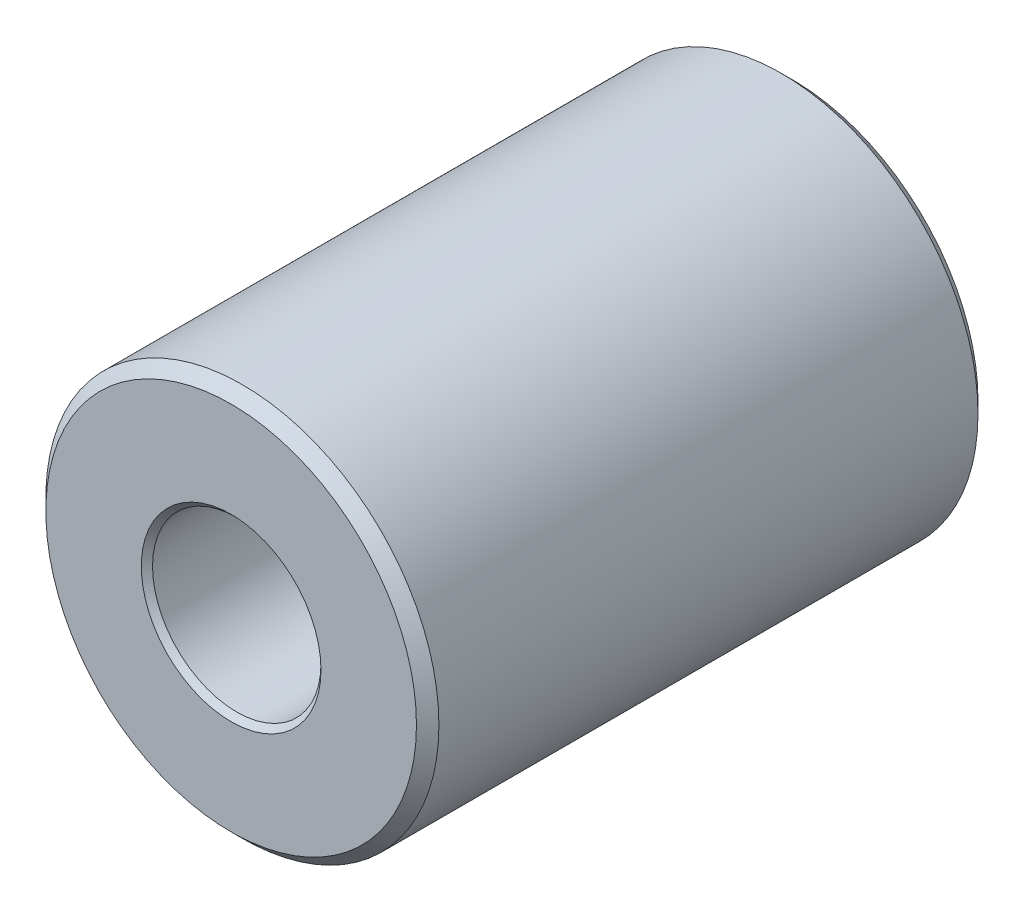
ISO-10303-21;
HEADER;
FILE_DESCRIPTION(('STEP AP214'),'2;1');
FILE_NAME('part.step','',(''),(''),'','','');
FILE_SCHEMA(('AUTOMOTIVE_DESIGN { 1 0 10303 214 1 1 1 1 }'));
ENDSEC;
DATA;
#1=APPLICATION_CONTEXT('core data for automotive mechanical design processes');
#2=APPLICATION_PROTOCOL_DEFINITION('international standard','automotive_design',2000,#1);
#3=PRODUCT_CONTEXT('',#1,'mechanical');
#4=PRODUCT('Part','Part','',(#3));
#5=PRODUCT_RELATED_PRODUCT_CATEGORY('part','',(#4));
#6=PRODUCT_DEFINITION_FORMATION('','',#4);
#7=PRODUCT_DEFINITION_CONTEXT('part definition',#1,'design');
#8=PRODUCT_DEFINITION('design','',#6,#7);
#9=PRODUCT_DEFINITION_SHAPE('','',#8);
#10=(LENGTH_UNIT() NAMED_UNIT(*) SI_UNIT(.MILLI.,.METRE.));
#11=(NAMED_UNIT(*) PLANE_ANGLE_UNIT() SI_UNIT($,.RADIAN.));
#12=(NAMED_UNIT(*) SI_UNIT($,.STERADIAN.) SOLID_ANGLE_UNIT());
#13=UNCERTAINTY_MEASURE_WITH_UNIT(LENGTH_MEASURE(1.E-05),#10,'distance_accuracy_value','');
#14=(GEOMETRIC_REPRESENTATION_CONTEXT(3) GLOBAL_UNCERTAINTY_ASSIGNED_CONTEXT((#13)) GLOBAL_UNIT_ASSIGNED_CONTEXT((#10,
#11,#12)) REPRESENTATION_CONTEXT('',''));
#15=CARTESIAN_POINT('',(0.,0.,0.));
#16=DIRECTION('',(0.,0.,1.));
#17=DIRECTION('',(1.,0.,0.));
#18=AXIS2_PLACEMENT_3D('',#15,#16,#17);
#19=CARTESIAN_POINT('',(6.09242737635672,-11.118651223378,10.));
#20=DIRECTION('',(0.,0.,-1.));
#21=DIRECTION('',(-1.,0.,0.));
#22=AXIS2_PLACEMENT_3D('',#19,#20,#21);
#23=CYLINDRICAL_SURFACE('',#22,3.5);
#24=CARTESIAN_POINT('',(6.09242737635672,-11.118651223378,0.200000000000001));
#25=DIRECTION('',(0.,0.,1.));
#26=DIRECTION('',(1.,0.,0.));
#27=AXIS2_PLACEMENT_3D('',#24,#25,#26);
#28=CIRCLE('',#27,3.5);
#29=CARTESIAN_POINT('',(9.59242737635672,-11.118651223378,0.200000000000001));
#30=VERTEX_POINT('',#29);
#31=EDGE_CURVE('E57',#30,#30,#28,.T.);
#32=ORIENTED_EDGE('',*,*,#31,.T.);
#33=EDGE_LOOP('',(#32));
#34=FACE_BOUND('',#33,.T.);
#35=CARTESIAN_POINT('',(6.09242737635672,-11.118651223378,9.8));
#36=DIRECTION('',(0.,0.,1.));
#37=DIRECTION('',(1.,0.,0.));
#38=AXIS2_PLACEMENT_3D('',#35,#36,#37);
#39=CIRCLE('',#38,3.5);
#40=CARTESIAN_POINT('',(9.59242737635672,-11.118651223378,9.8));
#41=VERTEX_POINT('',#40);
#42=EDGE_CURVE('E60',#41,#41,#39,.F.);
#43=ORIENTED_EDGE('',*,*,#42,.T.);
#44=EDGE_LOOP('',(#43));
#45=FACE_BOUND('',#44,.T.);
#46=ADVANCED_FACE('F31',(#34,#45),#23,.T.);
#47=CARTESIAN_POINT('',(6.09242737635672,-11.118651223378,10.));
#48=DIRECTION('',(0.,0.,1.));
#49=DIRECTION('',(1.,0.,0.));
#50=AXIS2_PLACEMENT_3D('',#47,#48,#49);
#51=PLANE('',#50);
#52=CARTESIAN_POINT('',(6.09242737635672,-11.118651223378,10.));
#53=DIRECTION('',(0.,0.,1.));
#54=DIRECTION('',(1.,0.,0.));
#55=AXIS2_PLACEMENT_3D('',#52,#53,#54);
#56=CIRCLE('',#55,1.6);
#57=CARTESIAN_POINT('',(7.69242737635672,-11.118651223378,10.));
#58=VERTEX_POINT('',#57);
#59=EDGE_CURVE('E38',#58,#58,#56,.F.);
#60=ORIENTED_EDGE('',*,*,#59,.T.);
#61=EDGE_LOOP('',(#60));
#62=FACE_BOUND('',#61,.T.);
#63=CARTESIAN_POINT('',(6.09242737635672,-11.118651223378,10.));
#64=DIRECTION('',(0.,0.,1.));
#65=DIRECTION('',(1.,0.,0.));
#66=AXIS2_PLACEMENT_3D('',#63,#64,#65);
#67=CIRCLE('',#66,3.3);
#68=CARTESIAN_POINT('',(9.39242737635673,-11.118651223378,10.));
#69=VERTEX_POINT('',#68);
#70=EDGE_CURVE('E51',#69,#69,#67,.T.);
#71=ORIENTED_EDGE('',*,*,#70,.T.);
#72=EDGE_LOOP('',(#71));
#73=FACE_BOUND('',#72,.T.);
#74=ADVANCED_FACE('F73',(#62,#73),#51,.T.);
#75=CARTESIAN_POINT('',(6.09242737635672,-11.118651223378,0.));
#76=DIRECTION('',(0.,0.,1.));
#77=DIRECTION('',(1.,0.,0.));
#78=AXIS2_PLACEMENT_3D('',#75,#76,#77);
#79=PLANE('',#78);
#80=CARTESIAN_POINT('',(6.09242737635672,-11.118651223378,0.));
#81=DIRECTION('',(0.,0.,1.));
#82=DIRECTION('',(1.,0.,0.));
#83=AXIS2_PLACEMENT_3D('',#80,#81,#82);
#84=CIRCLE('',#83,1.6);
#85=CARTESIAN_POINT('',(7.69242737635672,-11.118651223378,0.));
#86=VERTEX_POINT('',#85);
#87=EDGE_CURVE('E10',#86,#86,#84,.T.);
#88=ORIENTED_EDGE('',*,*,#87,.T.);
#89=EDGE_LOOP('',(#88));
#90=FACE_BOUND('',#89,.T.);
#91=CARTESIAN_POINT('',(6.09242737635672,-11.118651223378,0.));
#92=DIRECTION('',(0.,0.,1.));
#93=DIRECTION('',(1.,0.,0.));
#94=AXIS2_PLACEMENT_3D('',#91,#92,#93);
#95=CIRCLE('',#94,3.3);
#96=CARTESIAN_POINT('',(9.39242737635672,-11.118651223378,0.));
#97=VERTEX_POINT('',#96);
#98=EDGE_CURVE('E54',#97,#97,#95,.F.);
#99=ORIENTED_EDGE('',*,*,#98,.T.);
#100=EDGE_LOOP('',(#99));
#101=FACE_BOUND('',#100,.T.);
#102=ADVANCED_FACE('F75',(#90,#101),#79,.F.);
#103=CARTESIAN_POINT('',(6.09242737635672,-11.118651223378,0.));
#104=DIRECTION('',(0.,0.,1.));
#105=DIRECTION('',(1.,0.,0.));
#106=AXIS2_PLACEMENT_3D('',#103,#104,#105);
#107=CYLINDRICAL_SURFACE('',#106,1.5);
#108=CARTESIAN_POINT('',(6.09242737635672,-11.118651223378,9.9));
#109=DIRECTION('',(0.,0.,1.));
#110=DIRECTION('',(1.,0.,0.));
#111=AXIS2_PLACEMENT_3D('',#108,#109,#110);
#112=CIRCLE('',#111,1.5);
#113=CARTESIAN_POINT('',(7.59242737635672,-11.118651223378,9.9));
#114=VERTEX_POINT('',#113);
#115=EDGE_CURVE('E42',#114,#114,#112,.T.);
#116=ORIENTED_EDGE('',*,*,#115,.T.);
#117=EDGE_LOOP('',(#116));
#118=FACE_BOUND('',#117,.T.);
#119=CARTESIAN_POINT('',(6.09242737635672,-11.118651223378,0.0999999999999977));
#120=DIRECTION('',(0.,0.,1.));
#121=DIRECTION('',(1.,0.,0.));
#122=AXIS2_PLACEMENT_3D('',#119,#120,#121);
#123=CIRCLE('',#122,1.5);
#124=CARTESIAN_POINT('',(7.59242737635672,-11.118651223378,0.0999999999999977));
#125=VERTEX_POINT('',#124);
#126=EDGE_CURVE('E46',#125,#125,#123,.F.);
#127=ORIENTED_EDGE('',*,*,#126,.T.);
#128=EDGE_LOOP('',(#127));
#129=FACE_BOUND('',#128,.T.);
#130=ADVANCED_FACE('F81',(#118,#129),#107,.F.);
#131=CARTESIAN_POINT('',(6.09242737635672,-11.118651223378,0.200000000000001));
#132=DIRECTION('',(0.,0.,1.));
#133=DIRECTION('',(1.,0.,0.));
#134=AXIS2_PLACEMENT_3D('',#131,#132,#133);
#135=CONICAL_SURFACE('',#134,3.5,0.785398163397452);
#136=ORIENTED_EDGE('',*,*,#98,.F.);
#137=EDGE_LOOP('',(#136));
#138=FACE_BOUND('',#137,.T.);
#139=ORIENTED_EDGE('',*,*,#31,.F.);
#140=EDGE_LOOP('',(#139));
#141=FACE_BOUND('',#140,.T.);
#142=ADVANCED_FACE('F69',(#138,#141),#135,.T.);
#143=CARTESIAN_POINT('',(6.09242737635672,-11.118651223378,10.));
#144=DIRECTION('',(0.,0.,-1.));
#145=DIRECTION('',(-1.,0.,0.));
#146=AXIS2_PLACEMENT_3D('',#143,#144,#145);
#147=CONICAL_SURFACE('',#146,3.3,0.785398163397441);
#148=ORIENTED_EDGE('',*,*,#42,.F.);
#149=EDGE_LOOP('',(#148));
#150=FACE_BOUND('',#149,.T.);
#151=ORIENTED_EDGE('',*,*,#70,.F.);
#152=EDGE_LOOP('',(#151));
#153=FACE_BOUND('',#152,.T.);
#154=ADVANCED_FACE('F65',(#150,#153),#147,.T.);
#155=CARTESIAN_POINT('',(6.09242737635672,-11.118651223378,9.9));
#156=DIRECTION('',(0.,0.,1.));
#157=DIRECTION('',(1.,0.,0.));
#158=AXIS2_PLACEMENT_3D('',#155,#156,#157);
#159=CONICAL_SURFACE('',#158,1.5,0.785398163397448);
#160=ORIENTED_EDGE('',*,*,#59,.F.);
#161=EDGE_LOOP('',(#160));
#162=FACE_BOUND('',#161,.T.);
#163=ORIENTED_EDGE('',*,*,#115,.F.);
#164=EDGE_LOOP('',(#163));
#165=FACE_BOUND('',#164,.T.);
#166=ADVANCED_FACE('F68',(#162,#165),#159,.F.);
#167=CARTESIAN_POINT('',(6.09242737635672,-11.118651223378,0.));
#168=DIRECTION('',(0.,0.,-1.));
#169=DIRECTION('',(-1.,0.,0.));
#170=AXIS2_PLACEMENT_3D('',#167,#168,#169);
#171=CONICAL_SURFACE('',#170,1.6,0.785398163397448);
#172=ORIENTED_EDGE('',*,*,#126,.F.);
#173=EDGE_LOOP('',(#172));
#174=FACE_BOUND('',#173,.T.);
#175=ORIENTED_EDGE('',*,*,#87,.F.);
#176=EDGE_LOOP('',(#175));
#177=FACE_BOUND('',#176,.T.);
#178=ADVANCED_FACE('F33',(#174,#177),#171,.F.);
#179=CLOSED_SHELL('',(#46,#74,#102,#130,#142,#154,#166,#178));
#180=MANIFOLD_SOLID_BREP('B2',#179);
#181=ADVANCED_BREP_SHAPE_REPRESENTATION('',(#18,#180),#14);
#182=SHAPE_DEFINITION_REPRESENTATION(#9,#181);
ENDSEC;
END-ISO-10303-21;
